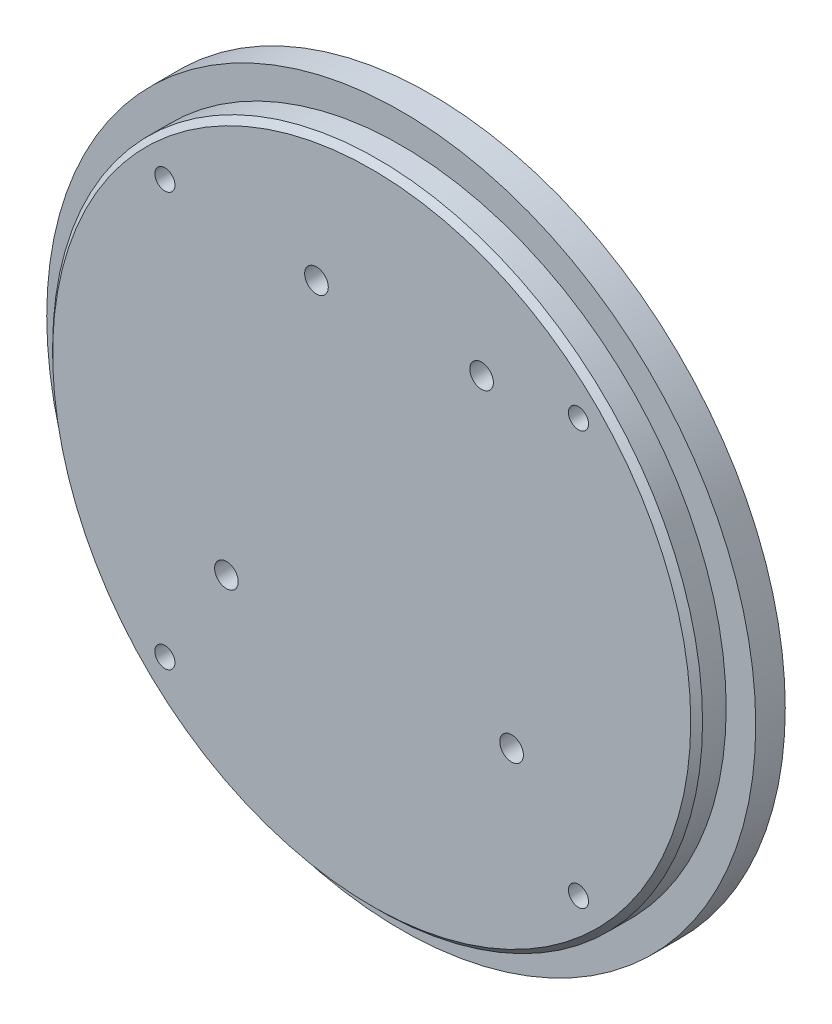
ISO-10303-21;
HEADER;
FILE_DESCRIPTION(('STEP AP214'),'2;1');
FILE_NAME('part.step','',(''),(''),'','','');
FILE_SCHEMA(('AUTOMOTIVE_DESIGN { 1 0 10303 214 1 1 1 1 }'));
ENDSEC;
DATA;
#1=APPLICATION_CONTEXT('core data for automotive mechanical design processes');
#2=APPLICATION_PROTOCOL_DEFINITION('international standard','automotive_design',2000,#1);
#3=PRODUCT_CONTEXT('',#1,'mechanical');
#4=PRODUCT('Part','Part','',(#3));
#5=PRODUCT_RELATED_PRODUCT_CATEGORY('part','',(#4));
#6=PRODUCT_DEFINITION_FORMATION('','',#4);
#7=PRODUCT_DEFINITION_CONTEXT('part definition',#1,'design');
#8=PRODUCT_DEFINITION('design','',#6,#7);
#9=PRODUCT_DEFINITION_SHAPE('','',#8);
#10=(LENGTH_UNIT() NAMED_UNIT(*) SI_UNIT(.MILLI.,.METRE.));
#11=(NAMED_UNIT(*) PLANE_ANGLE_UNIT() SI_UNIT($,.RADIAN.));
#12=(NAMED_UNIT(*) SI_UNIT($,.STERADIAN.) SOLID_ANGLE_UNIT());
#13=UNCERTAINTY_MEASURE_WITH_UNIT(LENGTH_MEASURE(1.E-05),#10,'distance_accuracy_value','');
#14=(GEOMETRIC_REPRESENTATION_CONTEXT(3) GLOBAL_UNCERTAINTY_ASSIGNED_CONTEXT((#13)) GLOBAL_UNIT_ASSIGNED_CONTEXT((#10,
#11,#12)) REPRESENTATION_CONTEXT('',''));
#15=CARTESIAN_POINT('',(0.,0.,0.));
#16=DIRECTION('',(0.,0.,1.));
#17=DIRECTION('',(1.,0.,0.));
#18=AXIS2_PLACEMENT_3D('',#15,#16,#17);
#19=CARTESIAN_POINT('',(0.,0.,-10.));
#20=DIRECTION('',(0.,0.,1.));
#21=DIRECTION('',(1.,0.,0.));
#22=AXIS2_PLACEMENT_3D('',#19,#20,#21);
#23=PLANE('',#22);
#24=CARTESIAN_POINT('',(35.,-35.,-10.));
#25=DIRECTION('',(0.,0.,-1.));
#26=DIRECTION('',(-1.,0.,0.));
#27=AXIS2_PLACEMENT_3D('',#24,#25,#26);
#28=CIRCLE('',#27,3.275);
#29=CARTESIAN_POINT('',(31.725,-35.,-10.));
#30=VERTEX_POINT('',#29);
#31=EDGE_CURVE('E126',#30,#30,#28,.T.);
#32=ORIENTED_EDGE('',*,*,#31,.F.);
#33=EDGE_LOOP('',(#32));
#34=FACE_BOUND('',#33,.T.);
#35=CARTESIAN_POINT('',(35.,35.,-10.));
#36=DIRECTION('',(0.,0.,-1.));
#37=DIRECTION('',(-1.,0.,0.));
#38=AXIS2_PLACEMENT_3D('',#35,#36,#37);
#39=CIRCLE('',#38,3.275);
#40=CARTESIAN_POINT('',(31.725,35.,-10.));
#41=VERTEX_POINT('',#40);
#42=EDGE_CURVE('E112',#41,#41,#39,.T.);
#43=ORIENTED_EDGE('',*,*,#42,.F.);
#44=EDGE_LOOP('',(#43));
#45=FACE_BOUND('',#44,.T.);
#46=CARTESIAN_POINT('',(-35.,-35.,-10.));
#47=DIRECTION('',(0.,0.,-1.));
#48=DIRECTION('',(-1.,0.,0.));
#49=AXIS2_PLACEMENT_3D('',#46,#47,#48);
#50=CIRCLE('',#49,3.275);
#51=CARTESIAN_POINT('',(-38.275,-35.,-10.));
#52=VERTEX_POINT('',#51);
#53=EDGE_CURVE('E100',#52,#52,#50,.T.);
#54=ORIENTED_EDGE('',*,*,#53,.F.);
#55=EDGE_LOOP('',(#54));
#56=FACE_BOUND('',#55,.T.);
#57=CARTESIAN_POINT('',(0.,0.,-10.));
#58=DIRECTION('',(0.,0.,-1.));
#59=DIRECTION('',(-1.,0.,0.));
#60=AXIS2_PLACEMENT_3D('',#57,#58,#59);
#61=CIRCLE('',#60,60.);
#62=CARTESIAN_POINT('',(-60.,0.,-10.));
#63=VERTEX_POINT('',#62);
#64=EDGE_CURVE('E79',#63,#63,#61,.T.);
#65=ORIENTED_EDGE('',*,*,#64,.T.);
#66=EDGE_LOOP('',(#65));
#67=FACE_BOUND('',#66,.T.);
#68=CARTESIAN_POINT('',(-35.,35.,-10.));
#69=DIRECTION('',(0.,0.,-1.));
#70=DIRECTION('',(-1.,0.,0.));
#71=AXIS2_PLACEMENT_3D('',#68,#69,#70);
#72=CIRCLE('',#71,3.275);
#73=CARTESIAN_POINT('',(-38.275,35.,-10.));
#74=VERTEX_POINT('',#73);
#75=EDGE_CURVE('E144',#74,#74,#72,.T.);
#76=ORIENTED_EDGE('',*,*,#75,.F.);
#77=EDGE_LOOP('',(#76));
#78=FACE_BOUND('',#77,.T.);
#79=ADVANCED_FACE('F39',(#34,#45,#56,#67,#78),#23,.F.);
#80=CARTESIAN_POINT('',(0.,0.,-10.));
#81=DIRECTION('',(0.,0.,1.));
#82=DIRECTION('',(1.,0.,0.));
#83=AXIS2_PLACEMENT_3D('',#80,#81,#82);
#84=CYLINDRICAL_SURFACE('',#83,55.);
#85=CARTESIAN_POINT('',(0.,0.,-1.00000000000001));
#86=DIRECTION('',(0.,0.,1.));
#87=DIRECTION('',(1.,0.,0.));
#88=AXIS2_PLACEMENT_3D('',#85,#86,#87);
#89=CIRCLE('',#88,55.);
#90=CARTESIAN_POINT('',(55.,0.,-1.00000000000001));
#91=VERTEX_POINT('',#90);
#92=EDGE_CURVE('E10',#91,#91,#89,.F.);
#93=ORIENTED_EDGE('',*,*,#92,.T.);
#94=EDGE_LOOP('',(#93));
#95=FACE_BOUND('',#94,.T.);
#96=CARTESIAN_POINT('',(0.,0.,-5.));
#97=DIRECTION('',(0.,0.,-1.));
#98=DIRECTION('',(-1.,0.,0.));
#99=AXIS2_PLACEMENT_3D('',#96,#97,#98);
#100=CIRCLE('',#99,55.);
#101=CARTESIAN_POINT('',(-55.,0.,-5.));
#102=VERTEX_POINT('',#101);
#103=EDGE_CURVE('E84',#102,#102,#100,.T.);
#104=ORIENTED_EDGE('',*,*,#103,.F.);
#105=EDGE_LOOP('',(#104));
#106=FACE_BOUND('',#105,.T.);
#107=ADVANCED_FACE('F151',(#95,#106),#84,.T.);
#108=CARTESIAN_POINT('',(0.,0.,0.));
#109=DIRECTION('',(0.,0.,1.));
#110=DIRECTION('',(1.,0.,0.));
#111=AXIS2_PLACEMENT_3D('',#108,#109,#110);
#112=PLANE('',#111);
#113=CARTESIAN_POINT('',(0.,0.,0.));
#114=DIRECTION('',(0.,0.,1.));
#115=DIRECTION('',(1.,0.,0.));
#116=AXIS2_PLACEMENT_3D('',#113,#114,#115);
#117=CIRCLE('',#116,54.);
#118=CARTESIAN_POINT('',(54.,0.,0.));
#119=VERTEX_POINT('',#118);
#120=EDGE_CURVE('E50',#119,#119,#117,.T.);
#121=ORIENTED_EDGE('',*,*,#120,.T.);
#122=EDGE_LOOP('',(#121));
#123=FACE_BOUND('',#122,.T.);
#124=CARTESIAN_POINT('',(-35.,35.,0.));
#125=DIRECTION('',(0.,0.,-1.));
#126=DIRECTION('',(-1.,0.,0.));
#127=AXIS2_PLACEMENT_3D('',#124,#125,#126);
#128=CIRCLE('',#127,1.7);
#129=CARTESIAN_POINT('',(-36.7,35.,0.));
#130=VERTEX_POINT('',#129);
#131=EDGE_CURVE('E135',#130,#130,#128,.T.);
#132=ORIENTED_EDGE('',*,*,#131,.T.);
#133=EDGE_LOOP('',(#132));
#134=FACE_BOUND('',#133,.T.);
#135=CARTESIAN_POINT('',(35.,-35.,0.));
#136=DIRECTION('',(0.,0.,-1.));
#137=DIRECTION('',(-1.,0.,0.));
#138=AXIS2_PLACEMENT_3D('',#135,#136,#137);
#139=CIRCLE('',#138,1.7);
#140=CARTESIAN_POINT('',(33.3,-35.,0.));
#141=VERTEX_POINT('',#140);
#142=EDGE_CURVE('E120',#141,#141,#139,.T.);
#143=ORIENTED_EDGE('',*,*,#142,.T.);
#144=EDGE_LOOP('',(#143));
#145=FACE_BOUND('',#144,.T.);
#146=CARTESIAN_POINT('',(35.,35.,0.));
#147=DIRECTION('',(0.,0.,-1.));
#148=DIRECTION('',(-1.,0.,0.));
#149=AXIS2_PLACEMENT_3D('',#146,#147,#148);
#150=CIRCLE('',#149,1.7);
#151=CARTESIAN_POINT('',(33.3,35.,0.));
#152=VERTEX_POINT('',#151);
#153=EDGE_CURVE('E105',#152,#152,#150,.T.);
#154=ORIENTED_EDGE('',*,*,#153,.T.);
#155=EDGE_LOOP('',(#154));
#156=FACE_BOUND('',#155,.T.);
#157=CARTESIAN_POINT('',(-35.,-35.,0.));
#158=DIRECTION('',(0.,0.,-1.));
#159=DIRECTION('',(-1.,0.,0.));
#160=AXIS2_PLACEMENT_3D('',#157,#158,#159);
#161=CIRCLE('',#160,1.7);
#162=CARTESIAN_POINT('',(-36.7,-35.,0.));
#163=VERTEX_POINT('',#162);
#164=EDGE_CURVE('E90',#163,#163,#161,.T.);
#165=ORIENTED_EDGE('',*,*,#164,.T.);
#166=EDGE_LOOP('',(#165));
#167=FACE_BOUND('',#166,.T.);
#168=CARTESIAN_POINT('',(23.6761448437186,-19.05,0.));
#169=DIRECTION('',(0.,0.,1.));
#170=DIRECTION('',(1.,0.,0.));
#171=AXIS2_PLACEMENT_3D('',#168,#169,#170);
#172=CIRCLE('',#171,2.);
#173=CARTESIAN_POINT('',(25.6761448437186,-19.05,0.));
#174=VERTEX_POINT('',#173);
#175=EDGE_CURVE('E54',#174,#174,#172,.T.);
#176=ORIENTED_EDGE('',*,*,#175,.F.);
#177=EDGE_LOOP('',(#176));
#178=FACE_BOUND('',#177,.T.);
#179=CARTESIAN_POINT('',(-9.3438551562814,33.02,0.));
#180=DIRECTION('',(0.,0.,1.));
#181=DIRECTION('',(1.,0.,0.));
#182=AXIS2_PLACEMENT_3D('',#179,#180,#181);
#183=CIRCLE('',#182,2.);
#184=CARTESIAN_POINT('',(-7.34385515628139,33.02,0.));
#185=VERTEX_POINT('',#184);
#186=EDGE_CURVE('E64',#185,#185,#183,.T.);
#187=ORIENTED_EDGE('',*,*,#186,.F.);
#188=EDGE_LOOP('',(#187));
#189=FACE_BOUND('',#188,.T.);
#190=CARTESIAN_POINT('',(18.5961448437186,33.02,0.));
#191=DIRECTION('',(0.,0.,1.));
#192=DIRECTION('',(1.,0.,0.));
#193=AXIS2_PLACEMENT_3D('',#190,#191,#192);
#194=CIRCLE('',#193,2.);
#195=CARTESIAN_POINT('',(20.5961448437186,33.02,0.));
#196=VERTEX_POINT('',#195);
#197=EDGE_CURVE('E62',#196,#196,#194,.T.);
#198=ORIENTED_EDGE('',*,*,#197,.F.);
#199=EDGE_LOOP('',(#198));
#200=FACE_BOUND('',#199,.T.);
#201=CARTESIAN_POINT('',(-24.5838551562814,-17.78,0.));
#202=DIRECTION('',(0.,0.,1.));
#203=DIRECTION('',(1.,0.,0.));
#204=AXIS2_PLACEMENT_3D('',#201,#202,#203);
#205=CIRCLE('',#204,2.);
#206=CARTESIAN_POINT('',(-22.5838551562814,-17.78,0.));
#207=VERTEX_POINT('',#206);
#208=EDGE_CURVE('E68',#207,#207,#205,.T.);
#209=ORIENTED_EDGE('',*,*,#208,.F.);
#210=EDGE_LOOP('',(#209));
#211=FACE_BOUND('',#210,.T.);
#212=ADVANCED_FACE('F156',(#123,#134,#145,#156,#167,#178,#189,#200,#211),#112,.T.);
#213=CARTESIAN_POINT('',(-24.5838551562814,-17.78,-8.));
#214=DIRECTION('',(0.,0.,1.));
#215=DIRECTION('',(1.,0.,0.));
#216=AXIS2_PLACEMENT_3D('',#213,#214,#215);
#217=CYLINDRICAL_SURFACE('',#216,2.);
#218=CARTESIAN_POINT('',(-24.5838551562814,-17.78,-8.));
#219=DIRECTION('',(0.,0.,1.));
#220=DIRECTION('',(1.,0.,0.));
#221=AXIS2_PLACEMENT_3D('',#218,#219,#220);
#222=CIRCLE('',#221,2.);
#223=CARTESIAN_POINT('',(-22.5838551562814,-17.78,-8.));
#224=VERTEX_POINT('',#223);
#225=EDGE_CURVE('E63',#224,#224,#222,.T.);
#226=ORIENTED_EDGE('',*,*,#225,.F.);
#227=EDGE_LOOP('',(#226));
#228=FACE_BOUND('',#227,.T.);
#229=ORIENTED_EDGE('',*,*,#208,.T.);
#230=EDGE_LOOP('',(#229));
#231=FACE_BOUND('',#230,.T.);
#232=ADVANCED_FACE('F170',(#228,#231),#217,.F.);
#233=CARTESIAN_POINT('',(-24.5838551562814,-17.78,-8.));
#234=DIRECTION('',(0.,0.,1.));
#235=DIRECTION('',(1.,0.,0.));
#236=AXIS2_PLACEMENT_3D('',#233,#234,#235);
#237=PLANE('',#236);
#238=ORIENTED_EDGE('',*,*,#225,.T.);
#239=EDGE_LOOP('',(#238));
#240=FACE_BOUND('',#239,.T.);
#241=ADVANCED_FACE('F175',(#240),#237,.T.);
#242=CARTESIAN_POINT('',(18.5961448437186,33.02,-8.));
#243=DIRECTION('',(0.,0.,1.));
#244=DIRECTION('',(1.,0.,0.));
#245=AXIS2_PLACEMENT_3D('',#242,#243,#244);
#246=CYLINDRICAL_SURFACE('',#245,2.);
#247=CARTESIAN_POINT('',(18.5961448437186,33.02,-8.));
#248=DIRECTION('',(0.,0.,1.));
#249=DIRECTION('',(1.,0.,0.));
#250=AXIS2_PLACEMENT_3D('',#247,#248,#249);
#251=CIRCLE('',#250,2.);
#252=CARTESIAN_POINT('',(20.5961448437186,33.02,-8.));
#253=VERTEX_POINT('',#252);
#254=EDGE_CURVE('E59',#253,#253,#251,.T.);
#255=ORIENTED_EDGE('',*,*,#254,.F.);
#256=EDGE_LOOP('',(#255));
#257=FACE_BOUND('',#256,.T.);
#258=ORIENTED_EDGE('',*,*,#197,.T.);
#259=EDGE_LOOP('',(#258));
#260=FACE_BOUND('',#259,.T.);
#261=ADVANCED_FACE('F195',(#257,#260),#246,.F.);
#262=CARTESIAN_POINT('',(18.5961448437186,33.02,-8.));
#263=DIRECTION('',(0.,0.,1.));
#264=DIRECTION('',(1.,0.,0.));
#265=AXIS2_PLACEMENT_3D('',#262,#263,#264);
#266=PLANE('',#265);
#267=ORIENTED_EDGE('',*,*,#254,.T.);
#268=EDGE_LOOP('',(#267));
#269=FACE_BOUND('',#268,.T.);
#270=ADVANCED_FACE('F165',(#269),#266,.T.);
#271=CARTESIAN_POINT('',(-9.3438551562814,33.02,-8.));
#272=DIRECTION('',(0.,0.,1.));
#273=DIRECTION('',(1.,0.,0.));
#274=AXIS2_PLACEMENT_3D('',#271,#272,#273);
#275=CYLINDRICAL_SURFACE('',#274,2.);
#276=CARTESIAN_POINT('',(-9.3438551562814,33.02,-8.));
#277=DIRECTION('',(0.,0.,1.));
#278=DIRECTION('',(1.,0.,0.));
#279=AXIS2_PLACEMENT_3D('',#276,#277,#278);
#280=CIRCLE('',#279,2.);
#281=CARTESIAN_POINT('',(-7.34385515628139,33.02,-8.));
#282=VERTEX_POINT('',#281);
#283=EDGE_CURVE('E72',#282,#282,#280,.T.);
#284=ORIENTED_EDGE('',*,*,#283,.F.);
#285=EDGE_LOOP('',(#284));
#286=FACE_BOUND('',#285,.T.);
#287=ORIENTED_EDGE('',*,*,#186,.T.);
#288=EDGE_LOOP('',(#287));
#289=FACE_BOUND('',#288,.T.);
#290=ADVANCED_FACE('F199',(#286,#289),#275,.F.);
#291=CARTESIAN_POINT('',(-9.3438551562814,33.02,-8.));
#292=DIRECTION('',(0.,0.,1.));
#293=DIRECTION('',(1.,0.,0.));
#294=AXIS2_PLACEMENT_3D('',#291,#292,#293);
#295=PLANE('',#294);
#296=ORIENTED_EDGE('',*,*,#283,.T.);
#297=EDGE_LOOP('',(#296));
#298=FACE_BOUND('',#297,.T.);
#299=ADVANCED_FACE('F207',(#298),#295,.T.);
#300=CARTESIAN_POINT('',(23.6761448437186,-19.05,-8.));
#301=DIRECTION('',(0.,0.,1.));
#302=DIRECTION('',(1.,0.,0.));
#303=AXIS2_PLACEMENT_3D('',#300,#301,#302);
#304=CYLINDRICAL_SURFACE('',#303,2.);
#305=CARTESIAN_POINT('',(23.6761448437186,-19.05,-8.));
#306=DIRECTION('',(0.,0.,1.));
#307=DIRECTION('',(1.,0.,0.));
#308=AXIS2_PLACEMENT_3D('',#305,#306,#307);
#309=CIRCLE('',#308,2.);
#310=CARTESIAN_POINT('',(25.6761448437186,-19.05,-8.));
#311=VERTEX_POINT('',#310);
#312=EDGE_CURVE('E51',#311,#311,#309,.T.);
#313=ORIENTED_EDGE('',*,*,#312,.F.);
#314=EDGE_LOOP('',(#313));
#315=FACE_BOUND('',#314,.T.);
#316=ORIENTED_EDGE('',*,*,#175,.T.);
#317=EDGE_LOOP('',(#316));
#318=FACE_BOUND('',#317,.T.);
#319=ADVANCED_FACE('F209',(#315,#318),#304,.F.);
#320=CARTESIAN_POINT('',(23.6761448437186,-19.05,-8.));
#321=DIRECTION('',(0.,0.,1.));
#322=DIRECTION('',(1.,0.,0.));
#323=AXIS2_PLACEMENT_3D('',#320,#321,#322);
#324=PLANE('',#323);
#325=ORIENTED_EDGE('',*,*,#312,.T.);
#326=EDGE_LOOP('',(#325));
#327=FACE_BOUND('',#326,.T.);
#328=ADVANCED_FACE('F216',(#327),#324,.T.);
#329=CARTESIAN_POINT('',(0.,0.,-5.));
#330=DIRECTION('',(0.,0.,-1.));
#331=DIRECTION('',(-1.,0.,0.));
#332=AXIS2_PLACEMENT_3D('',#329,#330,#331);
#333=CYLINDRICAL_SURFACE('',#332,60.);
#334=CARTESIAN_POINT('',(0.,0.,-5.));
#335=DIRECTION('',(0.,0.,-1.));
#336=DIRECTION('',(-1.,0.,0.));
#337=AXIS2_PLACEMENT_3D('',#334,#335,#336);
#338=CIRCLE('',#337,60.);
#339=CARTESIAN_POINT('',(-60.,0.,-5.));
#340=VERTEX_POINT('',#339);
#341=EDGE_CURVE('E71',#340,#340,#338,.T.);
#342=ORIENTED_EDGE('',*,*,#341,.T.);
#343=EDGE_LOOP('',(#342));
#344=FACE_BOUND('',#343,.T.);
#345=ORIENTED_EDGE('',*,*,#64,.F.);
#346=EDGE_LOOP('',(#345));
#347=FACE_BOUND('',#346,.T.);
#348=ADVANCED_FACE('F219',(#344,#347),#333,.T.);
#349=CARTESIAN_POINT('',(0.,0.,-5.));
#350=DIRECTION('',(0.,0.,-1.));
#351=DIRECTION('',(-1.,0.,0.));
#352=AXIS2_PLACEMENT_3D('',#349,#350,#351);
#353=PLANE('',#352);
#354=ORIENTED_EDGE('',*,*,#103,.T.);
#355=EDGE_LOOP('',(#354));
#356=FACE_BOUND('',#355,.T.);
#357=ORIENTED_EDGE('',*,*,#341,.F.);
#358=EDGE_LOOP('',(#357));
#359=FACE_BOUND('',#358,.T.);
#360=ADVANCED_FACE('F221',(#356,#359),#353,.F.);
#361=CARTESIAN_POINT('',(-35.,-35.,-10.));
#362=DIRECTION('',(0.,0.,-1.));
#363=DIRECTION('',(-1.,0.,0.));
#364=AXIS2_PLACEMENT_3D('',#361,#362,#363);
#365=CYLINDRICAL_SURFACE('',#364,1.7);
#366=ORIENTED_EDGE('',*,*,#164,.F.);
#367=EDGE_LOOP('',(#366));
#368=FACE_BOUND('',#367,.T.);
#369=CARTESIAN_POINT('',(-35.,-35.,-7.));
#370=DIRECTION('',(0.,0.,-1.));
#371=DIRECTION('',(-1.,0.,0.));
#372=AXIS2_PLACEMENT_3D('',#369,#370,#371);
#373=CIRCLE('',#372,1.7);
#374=CARTESIAN_POINT('',(-36.7,-35.,-7.));
#375=VERTEX_POINT('',#374);
#376=EDGE_CURVE('E89',#375,#375,#373,.T.);
#377=ORIENTED_EDGE('',*,*,#376,.T.);
#378=EDGE_LOOP('',(#377));
#379=FACE_BOUND('',#378,.T.);
#380=ADVANCED_FACE('F227',(#368,#379),#365,.F.);
#381=CARTESIAN_POINT('',(-31.75,-35.,-7.));
#382=DIRECTION('',(0.,0.,1.));
#383=DIRECTION('',(1.,0.,0.));
#384=AXIS2_PLACEMENT_3D('',#381,#382,#383);
#385=PLANE('',#384);
#386=ORIENTED_EDGE('',*,*,#376,.F.);
#387=EDGE_LOOP('',(#386));
#388=FACE_BOUND('',#387,.T.);
#389=CARTESIAN_POINT('',(-35.,-35.,-7.));
#390=DIRECTION('',(0.,0.,-1.));
#391=DIRECTION('',(-1.,0.,0.));
#392=AXIS2_PLACEMENT_3D('',#389,#390,#391);
#393=CIRCLE('',#392,3.25);
#394=CARTESIAN_POINT('',(-38.25,-35.,-7.));
#395=VERTEX_POINT('',#394);
#396=EDGE_CURVE('E94',#395,#395,#393,.T.);
#397=ORIENTED_EDGE('',*,*,#396,.T.);
#398=EDGE_LOOP('',(#397));
#399=FACE_BOUND('',#398,.T.);
#400=ADVANCED_FACE('F229',(#388,#399),#385,.F.);
#401=CARTESIAN_POINT('',(-35.,-35.,-10.));
#402=DIRECTION('',(0.,0.,-1.));
#403=DIRECTION('',(-1.,0.,0.));
#404=AXIS2_PLACEMENT_3D('',#401,#402,#403);
#405=CYLINDRICAL_SURFACE('',#404,3.25);
#406=ORIENTED_EDGE('',*,*,#396,.F.);
#407=EDGE_LOOP('',(#406));
#408=FACE_BOUND('',#407,.T.);
#409=CARTESIAN_POINT('',(-35.,-35.,-9.975));
#410=DIRECTION('',(0.,0.,-1.));
#411=DIRECTION('',(-1.,0.,0.));
#412=AXIS2_PLACEMENT_3D('',#409,#410,#411);
#413=CIRCLE('',#412,3.25);
#414=CARTESIAN_POINT('',(-38.25,-35.,-9.975));
#415=VERTEX_POINT('',#414);
#416=EDGE_CURVE('E98',#415,#415,#413,.T.);
#417=ORIENTED_EDGE('',*,*,#416,.T.);
#418=EDGE_LOOP('',(#417));
#419=FACE_BOUND('',#418,.T.);
#420=ADVANCED_FACE('F234',(#408,#419),#405,.F.);
#421=CARTESIAN_POINT('',(-35.,-35.,-10.));
#422=DIRECTION('',(0.,0.,-1.));
#423=DIRECTION('',(-1.,0.,0.));
#424=AXIS2_PLACEMENT_3D('',#421,#422,#423);
#425=CONICAL_SURFACE('',#424,3.275,0.785398163397379);
#426=ORIENTED_EDGE('',*,*,#416,.F.);
#427=EDGE_LOOP('',(#426));
#428=FACE_BOUND('',#427,.T.);
#429=ORIENTED_EDGE('',*,*,#53,.T.);
#430=EDGE_LOOP('',(#429));
#431=FACE_BOUND('',#430,.T.);
#432=ADVANCED_FACE('F238',(#428,#431),#425,.F.);
#433=CARTESIAN_POINT('',(35.,35.,-10.));
#434=DIRECTION('',(0.,0.,-1.));
#435=DIRECTION('',(-1.,0.,0.));
#436=AXIS2_PLACEMENT_3D('',#433,#434,#435);
#437=CYLINDRICAL_SURFACE('',#436,1.7);
#438=ORIENTED_EDGE('',*,*,#153,.F.);
#439=EDGE_LOOP('',(#438));
#440=FACE_BOUND('',#439,.T.);
#441=CARTESIAN_POINT('',(35.,35.,-7.));
#442=DIRECTION('',(0.,0.,-1.));
#443=DIRECTION('',(-1.,0.,0.));
#444=AXIS2_PLACEMENT_3D('',#441,#442,#443);
#445=CIRCLE('',#444,1.7);
#446=CARTESIAN_POINT('',(33.3,35.,-7.));
#447=VERTEX_POINT('',#446);
#448=EDGE_CURVE('E102',#447,#447,#445,.T.);
#449=ORIENTED_EDGE('',*,*,#448,.T.);
#450=EDGE_LOOP('',(#449));
#451=FACE_BOUND('',#450,.T.);
#452=ADVANCED_FACE('F245',(#440,#451),#437,.F.);
#453=CARTESIAN_POINT('',(38.25,35.,-7.));
#454=DIRECTION('',(0.,0.,1.));
#455=DIRECTION('',(1.,0.,0.));
#456=AXIS2_PLACEMENT_3D('',#453,#454,#455);
#457=PLANE('',#456);
#458=ORIENTED_EDGE('',*,*,#448,.F.);
#459=EDGE_LOOP('',(#458));
#460=FACE_BOUND('',#459,.T.);
#461=CARTESIAN_POINT('',(35.,35.,-7.));
#462=DIRECTION('',(0.,0.,-1.));
#463=DIRECTION('',(-1.,0.,0.));
#464=AXIS2_PLACEMENT_3D('',#461,#462,#463);
#465=CIRCLE('',#464,3.25);
#466=CARTESIAN_POINT('',(31.75,35.,-7.));
#467=VERTEX_POINT('',#466);
#468=EDGE_CURVE('E108',#467,#467,#465,.T.);
#469=ORIENTED_EDGE('',*,*,#468,.T.);
#470=EDGE_LOOP('',(#469));
#471=FACE_BOUND('',#470,.T.);
#472=ADVANCED_FACE('F246',(#460,#471),#457,.F.);
#473=CARTESIAN_POINT('',(35.,35.,-10.));
#474=DIRECTION('',(0.,0.,-1.));
#475=DIRECTION('',(-1.,0.,0.));
#476=AXIS2_PLACEMENT_3D('',#473,#474,#475);
#477=CYLINDRICAL_SURFACE('',#476,3.25);
#478=ORIENTED_EDGE('',*,*,#468,.F.);
#479=EDGE_LOOP('',(#478));
#480=FACE_BOUND('',#479,.T.);
#481=CARTESIAN_POINT('',(35.,35.,-9.975));
#482=DIRECTION('',(0.,0.,-1.));
#483=DIRECTION('',(-1.,0.,0.));
#484=AXIS2_PLACEMENT_3D('',#481,#482,#483);
#485=CIRCLE('',#484,3.25);
#486=CARTESIAN_POINT('',(31.75,35.,-9.975));
#487=VERTEX_POINT('',#486);
#488=EDGE_CURVE('E111',#487,#487,#485,.T.);
#489=ORIENTED_EDGE('',*,*,#488,.T.);
#490=EDGE_LOOP('',(#489));
#491=FACE_BOUND('',#490,.T.);
#492=ADVANCED_FACE('F249',(#480,#491),#477,.F.);
#493=CARTESIAN_POINT('',(35.,35.,-10.));
#494=DIRECTION('',(0.,0.,-1.));
#495=DIRECTION('',(-1.,0.,0.));
#496=AXIS2_PLACEMENT_3D('',#493,#494,#495);
#497=CONICAL_SURFACE('',#496,3.275,0.785398163397379);
#498=ORIENTED_EDGE('',*,*,#488,.F.);
#499=EDGE_LOOP('',(#498));
#500=FACE_BOUND('',#499,.T.);
#501=ORIENTED_EDGE('',*,*,#42,.T.);
#502=EDGE_LOOP('',(#501));
#503=FACE_BOUND('',#502,.T.);
#504=ADVANCED_FACE('F251',(#500,#503),#497,.F.);
#505=CARTESIAN_POINT('',(35.,-35.,-10.));
#506=DIRECTION('',(0.,0.,-1.));
#507=DIRECTION('',(-1.,0.,0.));
#508=AXIS2_PLACEMENT_3D('',#505,#506,#507);
#509=CYLINDRICAL_SURFACE('',#508,1.7);
#510=ORIENTED_EDGE('',*,*,#142,.F.);
#511=EDGE_LOOP('',(#510));
#512=FACE_BOUND('',#511,.T.);
#513=CARTESIAN_POINT('',(35.,-35.,-7.));
#514=DIRECTION('',(0.,0.,-1.));
#515=DIRECTION('',(-1.,0.,0.));
#516=AXIS2_PLACEMENT_3D('',#513,#514,#515);
#517=CIRCLE('',#516,1.7);
#518=CARTESIAN_POINT('',(33.3,-35.,-7.));
#519=VERTEX_POINT('',#518);
#520=EDGE_CURVE('E119',#519,#519,#517,.T.);
#521=ORIENTED_EDGE('',*,*,#520,.T.);
#522=EDGE_LOOP('',(#521));
#523=FACE_BOUND('',#522,.T.);
#524=ADVANCED_FACE('F260',(#512,#523),#509,.F.);
#525=CARTESIAN_POINT('',(38.25,-35.,-7.));
#526=DIRECTION('',(0.,0.,1.));
#527=DIRECTION('',(1.,0.,0.));
#528=AXIS2_PLACEMENT_3D('',#525,#526,#527);
#529=PLANE('',#528);
#530=ORIENTED_EDGE('',*,*,#520,.F.);
#531=EDGE_LOOP('',(#530));
#532=FACE_BOUND('',#531,.T.);
#533=CARTESIAN_POINT('',(35.,-35.,-7.));
#534=DIRECTION('',(0.,0.,-1.));
#535=DIRECTION('',(-1.,0.,0.));
#536=AXIS2_PLACEMENT_3D('',#533,#534,#535);
#537=CIRCLE('',#536,3.25);
#538=CARTESIAN_POINT('',(31.75,-35.,-7.));
#539=VERTEX_POINT('',#538);
#540=EDGE_CURVE('E124',#539,#539,#537,.T.);
#541=ORIENTED_EDGE('',*,*,#540,.T.);
#542=EDGE_LOOP('',(#541));
#543=FACE_BOUND('',#542,.T.);
#544=ADVANCED_FACE('F265',(#532,#543),#529,.F.);
#545=CARTESIAN_POINT('',(35.,-35.,-10.));
#546=DIRECTION('',(0.,0.,-1.));
#547=DIRECTION('',(-1.,0.,0.));
#548=AXIS2_PLACEMENT_3D('',#545,#546,#547);
#549=CYLINDRICAL_SURFACE('',#548,3.25);
#550=ORIENTED_EDGE('',*,*,#540,.F.);
#551=EDGE_LOOP('',(#550));
#552=FACE_BOUND('',#551,.T.);
#553=CARTESIAN_POINT('',(35.,-35.,-9.975));
#554=DIRECTION('',(0.,0.,-1.));
#555=DIRECTION('',(-1.,0.,0.));
#556=AXIS2_PLACEMENT_3D('',#553,#554,#555);
#557=CIRCLE('',#556,3.25);
#558=CARTESIAN_POINT('',(31.75,-35.,-9.975));
#559=VERTEX_POINT('',#558);
#560=EDGE_CURVE('E127',#559,#559,#557,.T.);
#561=ORIENTED_EDGE('',*,*,#560,.T.);
#562=EDGE_LOOP('',(#561));
#563=FACE_BOUND('',#562,.T.);
#564=ADVANCED_FACE('F267',(#552,#563),#549,.F.);
#565=CARTESIAN_POINT('',(35.,-35.,-10.));
#566=DIRECTION('',(0.,0.,-1.));
#567=DIRECTION('',(-1.,0.,0.));
#568=AXIS2_PLACEMENT_3D('',#565,#566,#567);
#569=CONICAL_SURFACE('',#568,3.275,0.785398163397379);
#570=ORIENTED_EDGE('',*,*,#560,.F.);
#571=EDGE_LOOP('',(#570));
#572=FACE_BOUND('',#571,.T.);
#573=ORIENTED_EDGE('',*,*,#31,.T.);
#574=EDGE_LOOP('',(#573));
#575=FACE_BOUND('',#574,.T.);
#576=ADVANCED_FACE('F268',(#572,#575),#569,.F.);
#577=CARTESIAN_POINT('',(-35.,35.,-10.));
#578=DIRECTION('',(0.,0.,-1.));
#579=DIRECTION('',(-1.,0.,0.));
#580=AXIS2_PLACEMENT_3D('',#577,#578,#579);
#581=CYLINDRICAL_SURFACE('',#580,1.7);
#582=ORIENTED_EDGE('',*,*,#131,.F.);
#583=EDGE_LOOP('',(#582));
#584=FACE_BOUND('',#583,.T.);
#585=CARTESIAN_POINT('',(-35.,35.,-7.));
#586=DIRECTION('',(0.,0.,-1.));
#587=DIRECTION('',(-1.,0.,0.));
#588=AXIS2_PLACEMENT_3D('',#585,#586,#587);
#589=CIRCLE('',#588,1.7);
#590=CARTESIAN_POINT('',(-36.7,35.,-7.));
#591=VERTEX_POINT('',#590);
#592=EDGE_CURVE('E134',#591,#591,#589,.T.);
#593=ORIENTED_EDGE('',*,*,#592,.T.);
#594=EDGE_LOOP('',(#593));
#595=FACE_BOUND('',#594,.T.);
#596=ADVANCED_FACE('F274',(#584,#595),#581,.F.);
#597=CARTESIAN_POINT('',(-31.75,35.,-7.));
#598=DIRECTION('',(0.,0.,1.));
#599=DIRECTION('',(1.,0.,0.));
#600=AXIS2_PLACEMENT_3D('',#597,#598,#599);
#601=PLANE('',#600);
#602=ORIENTED_EDGE('',*,*,#592,.F.);
#603=EDGE_LOOP('',(#602));
#604=FACE_BOUND('',#603,.T.);
#605=CARTESIAN_POINT('',(-35.,35.,-7.));
#606=DIRECTION('',(0.,0.,-1.));
#607=DIRECTION('',(-1.,0.,0.));
#608=AXIS2_PLACEMENT_3D('',#605,#606,#607);
#609=CIRCLE('',#608,3.25);
#610=CARTESIAN_POINT('',(-38.25,35.,-7.));
#611=VERTEX_POINT('',#610);
#612=EDGE_CURVE('E139',#611,#611,#609,.T.);
#613=ORIENTED_EDGE('',*,*,#612,.T.);
#614=EDGE_LOOP('',(#613));
#615=FACE_BOUND('',#614,.T.);
#616=ADVANCED_FACE('F280',(#604,#615),#601,.F.);
#617=CARTESIAN_POINT('',(-35.,35.,-10.));
#618=DIRECTION('',(0.,0.,-1.));
#619=DIRECTION('',(-1.,0.,0.));
#620=AXIS2_PLACEMENT_3D('',#617,#618,#619);
#621=CYLINDRICAL_SURFACE('',#620,3.25);
#622=ORIENTED_EDGE('',*,*,#612,.F.);
#623=EDGE_LOOP('',(#622));
#624=FACE_BOUND('',#623,.T.);
#625=CARTESIAN_POINT('',(-35.,35.,-9.975));
#626=DIRECTION('',(0.,0.,-1.));
#627=DIRECTION('',(-1.,0.,0.));
#628=AXIS2_PLACEMENT_3D('',#625,#626,#627);
#629=CIRCLE('',#628,3.25);
#630=CARTESIAN_POINT('',(-38.25,35.,-9.975));
#631=VERTEX_POINT('',#630);
#632=EDGE_CURVE('E142',#631,#631,#629,.T.);
#633=ORIENTED_EDGE('',*,*,#632,.T.);
#634=EDGE_LOOP('',(#633));
#635=FACE_BOUND('',#634,.T.);
#636=ADVANCED_FACE('F285',(#624,#635),#621,.F.);
#637=CARTESIAN_POINT('',(-35.,35.,-10.));
#638=DIRECTION('',(0.,0.,-1.));
#639=DIRECTION('',(-1.,0.,0.));
#640=AXIS2_PLACEMENT_3D('',#637,#638,#639);
#641=CONICAL_SURFACE('',#640,3.275,0.785398163397379);
#642=ORIENTED_EDGE('',*,*,#632,.F.);
#643=EDGE_LOOP('',(#642));
#644=FACE_BOUND('',#643,.T.);
#645=ORIENTED_EDGE('',*,*,#75,.T.);
#646=EDGE_LOOP('',(#645));
#647=FACE_BOUND('',#646,.T.);
#648=ADVANCED_FACE('F150',(#644,#647),#641,.F.);
#649=CARTESIAN_POINT('',(0.,0.,0.));
#650=DIRECTION('',(0.,0.,-1.));
#651=DIRECTION('',(-1.,0.,0.));
#652=AXIS2_PLACEMENT_3D('',#649,#650,#651);
#653=CONICAL_SURFACE('',#652,54.,0.785398163397455);
#654=ORIENTED_EDGE('',*,*,#92,.F.);
#655=EDGE_LOOP('',(#654));
#656=FACE_BOUND('',#655,.T.);
#657=ORIENTED_EDGE('',*,*,#120,.F.);
#658=EDGE_LOOP('',(#657));
#659=FACE_BOUND('',#658,.T.);
#660=ADVANCED_FACE('F45',(#656,#659),#653,.T.);
#661=CLOSED_SHELL('',(#79,#107,#212,#232,#241,#261,#270,#290,#299,#319,#328,#348,#360,#380,#400,
#420,#432,#452,#472,#492,#504,#524,#544,#564,#576,#596,#616,#636,#648,#660));
#662=MANIFOLD_SOLID_BREP('B2',#661);
#663=ADVANCED_BREP_SHAPE_REPRESENTATION('',(#18,#662),#14);
#664=SHAPE_DEFINITION_REPRESENTATION(#9,#663);
ENDSEC;
END-ISO-10303-21;
